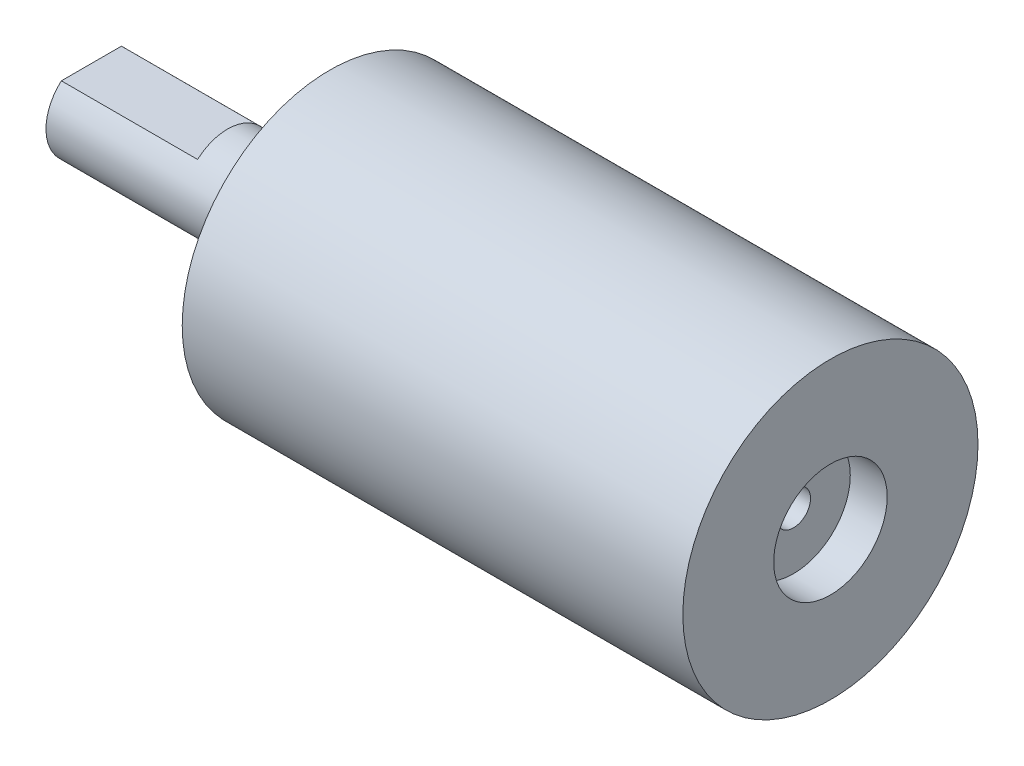
ISO-10303-21;
HEADER;
FILE_DESCRIPTION(('STEP AP214'),'2;1');
FILE_NAME('part.step','',(''),(''),'','','');
FILE_SCHEMA(('AUTOMOTIVE_DESIGN { 1 0 10303 214 1 1 1 1 }'));
ENDSEC;
DATA;
#1=APPLICATION_CONTEXT('core data for automotive mechanical design processes');
#2=APPLICATION_PROTOCOL_DEFINITION('international standard','automotive_design',2000,#1);
#3=PRODUCT_CONTEXT('',#1,'mechanical');
#4=PRODUCT('Part','Part','',(#3));
#5=PRODUCT_RELATED_PRODUCT_CATEGORY('part','',(#4));
#6=PRODUCT_DEFINITION_FORMATION('','',#4);
#7=PRODUCT_DEFINITION_CONTEXT('part definition',#1,'design');
#8=PRODUCT_DEFINITION('design','',#6,#7);
#9=PRODUCT_DEFINITION_SHAPE('','',#8);
#10=(LENGTH_UNIT() NAMED_UNIT(*) SI_UNIT(.MILLI.,.METRE.));
#11=(NAMED_UNIT(*) PLANE_ANGLE_UNIT() SI_UNIT($,.RADIAN.));
#12=(NAMED_UNIT(*) SI_UNIT($,.STERADIAN.) SOLID_ANGLE_UNIT());
#13=UNCERTAINTY_MEASURE_WITH_UNIT(LENGTH_MEASURE(1.E-05),#10,'distance_accuracy_value','');
#14=(GEOMETRIC_REPRESENTATION_CONTEXT(3) GLOBAL_UNCERTAINTY_ASSIGNED_CONTEXT((#13)) GLOBAL_UNIT_ASSIGNED_CONTEXT((#10,
#11,#12)) REPRESENTATION_CONTEXT('',''));
#15=CARTESIAN_POINT('',(0.,0.,0.));
#16=DIRECTION('',(0.,0.,1.));
#17=DIRECTION('',(1.,0.,0.));
#18=AXIS2_PLACEMENT_3D('',#15,#16,#17);
#19=CARTESIAN_POINT('',(0.,0.,0.));
#20=DIRECTION('',(-1.,0.,0.));
#21=DIRECTION('',(0.,0.,1.));
#22=AXIS2_PLACEMENT_3D('',#19,#20,#21);
#23=PLANE('',#22);
#24=DIRECTION('',(0.,0.,1.));
#25=VECTOR('',#24,1.);
#26=CARTESIAN_POINT('',(0.,3.,-2.64575131106459));
#27=LINE('',#26,#25);
#28=CARTESIAN_POINT('',(0.,3.,-2.64575131106459));
#29=VERTEX_POINT('',#28);
#30=CARTESIAN_POINT('',(0.,3.,2.64575131106459));
#31=VERTEX_POINT('',#30);
#32=EDGE_CURVE('E62',#29,#31,#27,.T.);
#33=ORIENTED_EDGE('',*,*,#32,.F.);
#34=CARTESIAN_POINT('',(0.,0.,0.));
#35=DIRECTION('',(1.,0.,0.));
#36=DIRECTION('',(0.,0.,-1.));
#37=AXIS2_PLACEMENT_3D('',#34,#35,#36);
#38=CIRCLE('',#37,4.);
#39=EDGE_CURVE('E11',#31,#29,#38,.T.);
#40=ORIENTED_EDGE('',*,*,#39,.F.);
#41=EDGE_LOOP('',(#33,#40));
#42=FACE_BOUND('',#41,.T.);
#43=ADVANCED_FACE('F34',(#42),#23,.T.);
#44=CARTESIAN_POINT('',(0.,0.,0.));
#45=DIRECTION('',(1.,0.,0.));
#46=DIRECTION('',(0.,0.,-1.));
#47=AXIS2_PLACEMENT_3D('',#44,#45,#46);
#48=CYLINDRICAL_SURFACE('',#47,4.);
#49=DIRECTION('',(-1.,0.,0.));
#50=VECTOR('',#49,1.);
#51=CARTESIAN_POINT('',(12.,3.,-2.64575131106459));
#52=LINE('',#51,#50);
#53=CARTESIAN_POINT('',(12.,3.,-2.64575131106459));
#54=VERTEX_POINT('',#53);
#55=EDGE_CURVE('E59',#54,#29,#52,.T.);
#56=ORIENTED_EDGE('',*,*,#55,.F.);
#57=CARTESIAN_POINT('',(12.,0.,0.));
#58=DIRECTION('',(-1.,0.,0.));
#59=DIRECTION('',(0.,0.,1.));
#60=AXIS2_PLACEMENT_3D('',#57,#58,#59);
#61=CIRCLE('',#60,4.);
#62=CARTESIAN_POINT('',(12.,3.,2.64575131106459));
#63=VERTEX_POINT('',#62);
#64=EDGE_CURVE('E52',#63,#54,#61,.T.);
#65=ORIENTED_EDGE('',*,*,#64,.F.);
#66=DIRECTION('',(-1.,0.,0.));
#67=VECTOR('',#66,1.);
#68=CARTESIAN_POINT('',(12.,3.,2.64575131106459));
#69=LINE('',#68,#67);
#70=EDGE_CURVE('E65',#63,#31,#69,.T.);
#71=ORIENTED_EDGE('',*,*,#70,.T.);
#72=ORIENTED_EDGE('',*,*,#39,.T.);
#73=EDGE_LOOP('',(#56,#65,#71,#72));
#74=FACE_BOUND('',#73,.T.);
#75=CARTESIAN_POINT('',(19.,0.,0.));
#76=DIRECTION('',(1.,0.,0.));
#77=DIRECTION('',(0.,0.,-1.));
#78=AXIS2_PLACEMENT_3D('',#75,#76,#77);
#79=CIRCLE('',#78,4.);
#80=CARTESIAN_POINT('',(19.,0.,-4.));
#81=VERTEX_POINT('',#80);
#82=EDGE_CURVE('E41',#81,#81,#79,.T.);
#83=ORIENTED_EDGE('',*,*,#82,.F.);
#84=EDGE_LOOP('',(#83));
#85=FACE_BOUND('',#84,.T.);
#86=ADVANCED_FACE('F70',(#74,#85),#48,.T.);
#87=CARTESIAN_POINT('',(19.,4.,0.));
#88=DIRECTION('',(-1.,0.,0.));
#89=DIRECTION('',(0.,0.,1.));
#90=AXIS2_PLACEMENT_3D('',#87,#88,#89);
#91=PLANE('',#90);
#92=ORIENTED_EDGE('',*,*,#82,.T.);
#93=EDGE_LOOP('',(#92));
#94=FACE_BOUND('',#93,.T.);
#95=CARTESIAN_POINT('',(19.,0.,0.));
#96=DIRECTION('',(1.,0.,0.));
#97=DIRECTION('',(0.,0.,-1.));
#98=AXIS2_PLACEMENT_3D('',#95,#96,#97);
#99=CIRCLE('',#98,9.5);
#100=CARTESIAN_POINT('',(19.,0.,-9.5));
#101=VERTEX_POINT('',#100);
#102=EDGE_CURVE('E132',#101,#101,#99,.T.);
#103=ORIENTED_EDGE('',*,*,#102,.F.);
#104=EDGE_LOOP('',(#103));
#105=FACE_BOUND('',#104,.T.);
#106=ADVANCED_FACE('F137',(#94,#105),#91,.T.);
#107=CARTESIAN_POINT('',(0.,0.,0.));
#108=DIRECTION('',(1.,0.,0.));
#109=DIRECTION('',(0.,0.,-1.));
#110=AXIS2_PLACEMENT_3D('',#107,#108,#109);
#111=CYLINDRICAL_SURFACE('',#110,9.5);
#112=ORIENTED_EDGE('',*,*,#102,.T.);
#113=EDGE_LOOP('',(#112));
#114=FACE_BOUND('',#113,.T.);
#115=CARTESIAN_POINT('',(21.,0.,0.));
#116=DIRECTION('',(1.,0.,0.));
#117=DIRECTION('',(0.,0.,-1.));
#118=AXIS2_PLACEMENT_3D('',#115,#116,#117);
#119=CIRCLE('',#118,9.5);
#120=CARTESIAN_POINT('',(21.,0.,-9.5));
#121=VERTEX_POINT('',#120);
#122=EDGE_CURVE('E129',#121,#121,#119,.T.);
#123=ORIENTED_EDGE('',*,*,#122,.F.);
#124=EDGE_LOOP('',(#123));
#125=FACE_BOUND('',#124,.T.);
#126=ADVANCED_FACE('F144',(#114,#125),#111,.T.);
#127=CARTESIAN_POINT('',(21.,9.5,0.));
#128=DIRECTION('',(-1.,0.,0.));
#129=DIRECTION('',(0.,0.,1.));
#130=AXIS2_PLACEMENT_3D('',#127,#128,#129);
#131=PLANE('',#130);
#132=CARTESIAN_POINT('',(21.,11.25,0.));
#133=DIRECTION('',(-1.,0.,0.));
#134=DIRECTION('',(0.,0.,1.));
#135=AXIS2_PLACEMENT_3D('',#132,#133,#134);
#136=CIRCLE('',#135,1.);
#137=CARTESIAN_POINT('',(21.,11.25,1.));
#138=VERTEX_POINT('',#137);
#139=EDGE_CURVE('E83',#138,#138,#136,.T.);
#140=ORIENTED_EDGE('',*,*,#139,.F.);
#141=EDGE_LOOP('',(#140));
#142=FACE_BOUND('',#141,.T.);
#143=CARTESIAN_POINT('',(21.,5.62499999999944,-9.74278579257462));
#144=DIRECTION('',(-1.,0.,0.));
#145=DIRECTION('',(0.,0.,1.));
#146=AXIS2_PLACEMENT_3D('',#143,#144,#145);
#147=CIRCLE('',#146,1.0000000000006);
#148=CARTESIAN_POINT('',(21.,5.62499999999944,-8.74278579257402));
#149=VERTEX_POINT('',#148);
#150=EDGE_CURVE('E72',#149,#149,#147,.T.);
#151=ORIENTED_EDGE('',*,*,#150,.F.);
#152=EDGE_LOOP('',(#151));
#153=FACE_BOUND('',#152,.T.);
#154=CARTESIAN_POINT('',(21.,-5.62500000000056,-9.74278579257398));
#155=DIRECTION('',(-1.,0.,0.));
#156=DIRECTION('',(0.,0.,1.));
#157=AXIS2_PLACEMENT_3D('',#154,#155,#156);
#158=CIRCLE('',#157,1.00000000000118);
#159=CARTESIAN_POINT('',(21.,-5.62500000000056,-8.74278579257279));
#160=VERTEX_POINT('',#159);
#161=EDGE_CURVE('E88',#160,#160,#158,.T.);
#162=ORIENTED_EDGE('',*,*,#161,.F.);
#163=EDGE_LOOP('',(#162));
#164=FACE_BOUND('',#163,.T.);
#165=CARTESIAN_POINT('',(21.,-11.25,1.2762214690701E-12));
#166=DIRECTION('',(-1.,0.,0.));
#167=DIRECTION('',(0.,0.,1.));
#168=AXIS2_PLACEMENT_3D('',#165,#166,#167);
#169=CIRCLE('',#168,1.0000000000013);
#170=CARTESIAN_POINT('',(21.,-11.25,1.00000000000257));
#171=VERTEX_POINT('',#170);
#172=EDGE_CURVE('E104',#171,#171,#169,.T.);
#173=ORIENTED_EDGE('',*,*,#172,.F.);
#174=EDGE_LOOP('',(#173));
#175=FACE_BOUND('',#174,.T.);
#176=CARTESIAN_POINT('',(21.,-5.62499999999945,9.74278579257589));
#177=DIRECTION('',(-1.,0.,0.));
#178=DIRECTION('',(0.,0.,1.));
#179=AXIS2_PLACEMENT_3D('',#176,#177,#178);
#180=CIRCLE('',#179,1.00000000000081);
#181=CARTESIAN_POINT('',(21.,-5.62499999999945,10.7427857925767));
#182=VERTEX_POINT('',#181);
#183=EDGE_CURVE('E98',#182,#182,#180,.T.);
#184=ORIENTED_EDGE('',*,*,#183,.F.);
#185=EDGE_LOOP('',(#184));
#186=FACE_BOUND('',#185,.T.);
#187=CARTESIAN_POINT('',(21.,5.62500000000056,9.74278579257525));
#188=DIRECTION('',(-1.,0.,0.));
#189=DIRECTION('',(0.,0.,1.));
#190=AXIS2_PLACEMENT_3D('',#187,#188,#189);
#191=CIRCLE('',#190,1.00000000000017);
#192=CARTESIAN_POINT('',(21.,5.62500000000056,10.7427857925754));
#193=VERTEX_POINT('',#192);
#194=EDGE_CURVE('E92',#193,#193,#191,.T.);
#195=ORIENTED_EDGE('',*,*,#194,.F.);
#196=EDGE_LOOP('',(#195));
#197=FACE_BOUND('',#196,.T.);
#198=ORIENTED_EDGE('',*,*,#122,.T.);
#199=EDGE_LOOP('',(#198));
#200=FACE_BOUND('',#199,.T.);
#201=CARTESIAN_POINT('',(21.,0.,0.));
#202=DIRECTION('',(1.,0.,0.));
#203=DIRECTION('',(0.,0.,-1.));
#204=AXIS2_PLACEMENT_3D('',#201,#202,#203);
#205=CIRCLE('',#204,13.);
#206=CARTESIAN_POINT('',(21.,0.,-13.));
#207=VERTEX_POINT('',#206);
#208=EDGE_CURVE('E126',#207,#207,#205,.T.);
#209=ORIENTED_EDGE('',*,*,#208,.F.);
#210=EDGE_LOOP('',(#209));
#211=FACE_BOUND('',#210,.T.);
#212=ADVANCED_FACE('F149',(#142,#153,#164,#175,#186,#197,#200,#211),#131,.T.);
#213=CARTESIAN_POINT('',(0.,0.,0.));
#214=DIRECTION('',(1.,0.,0.));
#215=DIRECTION('',(0.,0.,-1.));
#216=AXIS2_PLACEMENT_3D('',#213,#214,#215);
#217=CYLINDRICAL_SURFACE('',#216,13.);
#218=ORIENTED_EDGE('',*,*,#208,.T.);
#219=EDGE_LOOP('',(#218));
#220=FACE_BOUND('',#219,.T.);
#221=CARTESIAN_POINT('',(65.1,0.,0.));
#222=DIRECTION('',(1.,0.,0.));
#223=DIRECTION('',(0.,0.,-1.));
#224=AXIS2_PLACEMENT_3D('',#221,#222,#223);
#225=CIRCLE('',#224,13.);
#226=CARTESIAN_POINT('',(65.1,0.,-13.));
#227=VERTEX_POINT('',#226);
#228=EDGE_CURVE('E123',#227,#227,#225,.T.);
#229=ORIENTED_EDGE('',*,*,#228,.F.);
#230=EDGE_LOOP('',(#229));
#231=FACE_BOUND('',#230,.T.);
#232=ADVANCED_FACE('F153',(#220,#231),#217,.T.);
#233=CARTESIAN_POINT('',(65.1,13.,0.));
#234=DIRECTION('',(1.,0.,0.));
#235=DIRECTION('',(0.,0.,-1.));
#236=AXIS2_PLACEMENT_3D('',#233,#234,#235);
#237=PLANE('',#236);
#238=ORIENTED_EDGE('',*,*,#228,.T.);
#239=EDGE_LOOP('',(#238));
#240=FACE_BOUND('',#239,.T.);
#241=CARTESIAN_POINT('',(65.1,0.,0.));
#242=DIRECTION('',(1.,0.,0.));
#243=DIRECTION('',(0.,0.,-1.));
#244=AXIS2_PLACEMENT_3D('',#241,#242,#243);
#245=CIRCLE('',#244,5.00000000000001);
#246=CARTESIAN_POINT('',(65.1,0.,-5.00000000000001));
#247=VERTEX_POINT('',#246);
#248=EDGE_CURVE('E120',#247,#247,#245,.T.);
#249=ORIENTED_EDGE('',*,*,#248,.F.);
#250=EDGE_LOOP('',(#249));
#251=FACE_BOUND('',#250,.T.);
#252=ADVANCED_FACE('F157',(#240,#251),#237,.T.);
#253=CARTESIAN_POINT('',(0.,0.,0.));
#254=DIRECTION('',(1.,0.,0.));
#255=DIRECTION('',(0.,0.,-1.));
#256=AXIS2_PLACEMENT_3D('',#253,#254,#255);
#257=CYLINDRICAL_SURFACE('',#256,5.00000000000001);
#258=ORIENTED_EDGE('',*,*,#248,.T.);
#259=EDGE_LOOP('',(#258));
#260=FACE_BOUND('',#259,.T.);
#261=CARTESIAN_POINT('',(61.85,0.,0.));
#262=DIRECTION('',(1.,0.,0.));
#263=DIRECTION('',(0.,0.,-1.));
#264=AXIS2_PLACEMENT_3D('',#261,#262,#263);
#265=CIRCLE('',#264,5.00000000000001);
#266=CARTESIAN_POINT('',(61.85,0.,-5.00000000000001));
#267=VERTEX_POINT('',#266);
#268=EDGE_CURVE('E117',#267,#267,#265,.T.);
#269=ORIENTED_EDGE('',*,*,#268,.F.);
#270=EDGE_LOOP('',(#269));
#271=FACE_BOUND('',#270,.T.);
#272=ADVANCED_FACE('F161',(#260,#271),#257,.F.);
#273=CARTESIAN_POINT('',(61.85,5.00000000000001,0.));
#274=DIRECTION('',(1.,0.,0.));
#275=DIRECTION('',(0.,0.,-1.));
#276=AXIS2_PLACEMENT_3D('',#273,#274,#275);
#277=PLANE('',#276);
#278=ORIENTED_EDGE('',*,*,#268,.T.);
#279=EDGE_LOOP('',(#278));
#280=FACE_BOUND('',#279,.T.);
#281=CARTESIAN_POINT('',(61.85,0.,0.));
#282=DIRECTION('',(1.,0.,0.));
#283=DIRECTION('',(0.,0.,-1.));
#284=AXIS2_PLACEMENT_3D('',#281,#282,#283);
#285=CIRCLE('',#284,1.50000000000001);
#286=CARTESIAN_POINT('',(61.85,0.,-1.50000000000001));
#287=VERTEX_POINT('',#286);
#288=EDGE_CURVE('E114',#287,#287,#285,.T.);
#289=ORIENTED_EDGE('',*,*,#288,.F.);
#290=EDGE_LOOP('',(#289));
#291=FACE_BOUND('',#290,.T.);
#292=ADVANCED_FACE('F165',(#280,#291),#277,.T.);
#293=CARTESIAN_POINT('',(0.,0.,0.));
#294=DIRECTION('',(1.,0.,0.));
#295=DIRECTION('',(0.,0.,-1.));
#296=AXIS2_PLACEMENT_3D('',#293,#294,#295);
#297=CYLINDRICAL_SURFACE('',#296,1.50000000000001);
#298=ORIENTED_EDGE('',*,*,#288,.T.);
#299=EDGE_LOOP('',(#298));
#300=FACE_BOUND('',#299,.T.);
#301=CARTESIAN_POINT('',(54.1,0.,0.));
#302=DIRECTION('',(1.,0.,0.));
#303=DIRECTION('',(0.,0.,-1.));
#304=AXIS2_PLACEMENT_3D('',#301,#302,#303);
#305=CIRCLE('',#304,1.50000000000001);
#306=CARTESIAN_POINT('',(54.1,0.,-1.50000000000001));
#307=VERTEX_POINT('',#306);
#308=EDGE_CURVE('E82',#307,#307,#305,.T.);
#309=ORIENTED_EDGE('',*,*,#308,.F.);
#310=EDGE_LOOP('',(#309));
#311=FACE_BOUND('',#310,.T.);
#312=ADVANCED_FACE('F169',(#300,#311),#297,.F.);
#313=CARTESIAN_POINT('',(54.1,1.50000000000001,0.));
#314=DIRECTION('',(1.,0.,0.));
#315=DIRECTION('',(0.,0.,-1.));
#316=AXIS2_PLACEMENT_3D('',#313,#314,#315);
#317=PLANE('',#316);
#318=ORIENTED_EDGE('',*,*,#308,.T.);
#319=EDGE_LOOP('',(#318));
#320=FACE_BOUND('',#319,.T.);
#321=ADVANCED_FACE('F173',(#320),#317,.T.);
#322=CARTESIAN_POINT('',(24.6,5.62500000000056,9.74278579257525));
#323=DIRECTION('',(-1.,0.,0.));
#324=DIRECTION('',(0.,0.,1.));
#325=AXIS2_PLACEMENT_3D('',#322,#323,#324);
#326=CYLINDRICAL_SURFACE('',#325,1.00000000000017);
#327=CARTESIAN_POINT('',(24.6,5.62500000000056,9.74278579257525));
#328=DIRECTION('',(-1.,0.,0.));
#329=DIRECTION('',(0.,0.,1.));
#330=AXIS2_PLACEMENT_3D('',#327,#328,#329);
#331=CIRCLE('',#330,1.00000000000017);
#332=CARTESIAN_POINT('',(24.6,5.62500000000056,10.7427857925754));
#333=VERTEX_POINT('',#332);
#334=EDGE_CURVE('E86',#333,#333,#331,.T.);
#335=ORIENTED_EDGE('',*,*,#334,.F.);
#336=EDGE_LOOP('',(#335));
#337=FACE_BOUND('',#336,.T.);
#338=ORIENTED_EDGE('',*,*,#194,.T.);
#339=EDGE_LOOP('',(#338));
#340=FACE_BOUND('',#339,.T.);
#341=ADVANCED_FACE('F177',(#337,#340),#326,.F.);
#342=CARTESIAN_POINT('',(24.6,5.62500000000056,9.74278579257525));
#343=DIRECTION('',(-1.,0.,0.));
#344=DIRECTION('',(0.,0.,1.));
#345=AXIS2_PLACEMENT_3D('',#342,#343,#344);
#346=PLANE('',#345);
#347=ORIENTED_EDGE('',*,*,#334,.T.);
#348=EDGE_LOOP('',(#347));
#349=FACE_BOUND('',#348,.T.);
#350=ADVANCED_FACE('F200',(#349),#346,.T.);
#351=CARTESIAN_POINT('',(24.6,-5.62499999999945,9.74278579257589));
#352=DIRECTION('',(-1.,0.,0.));
#353=DIRECTION('',(0.,0.,1.));
#354=AXIS2_PLACEMENT_3D('',#351,#352,#353);
#355=CYLINDRICAL_SURFACE('',#354,1.00000000000081);
#356=CARTESIAN_POINT('',(24.6,-5.62499999999945,9.74278579257589));
#357=DIRECTION('',(-1.,0.,0.));
#358=DIRECTION('',(0.,0.,1.));
#359=AXIS2_PLACEMENT_3D('',#356,#357,#358);
#360=CIRCLE('',#359,1.00000000000081);
#361=CARTESIAN_POINT('',(24.6,-5.62499999999945,10.7427857925767));
#362=VERTEX_POINT('',#361);
#363=EDGE_CURVE('E95',#362,#362,#360,.T.);
#364=ORIENTED_EDGE('',*,*,#363,.F.);
#365=EDGE_LOOP('',(#364));
#366=FACE_BOUND('',#365,.T.);
#367=ORIENTED_EDGE('',*,*,#183,.T.);
#368=EDGE_LOOP('',(#367));
#369=FACE_BOUND('',#368,.T.);
#370=ADVANCED_FACE('F197',(#366,#369),#355,.F.);
#371=CARTESIAN_POINT('',(24.6,-5.62499999999945,9.74278579257589));
#372=DIRECTION('',(-1.,0.,0.));
#373=DIRECTION('',(0.,0.,1.));
#374=AXIS2_PLACEMENT_3D('',#371,#372,#373);
#375=PLANE('',#374);
#376=ORIENTED_EDGE('',*,*,#363,.T.);
#377=EDGE_LOOP('',(#376));
#378=FACE_BOUND('',#377,.T.);
#379=ADVANCED_FACE('F192',(#378),#375,.T.);
#380=CARTESIAN_POINT('',(24.6,-11.25,1.2762214690701E-12));
#381=DIRECTION('',(-1.,0.,0.));
#382=DIRECTION('',(0.,0.,1.));
#383=AXIS2_PLACEMENT_3D('',#380,#381,#382);
#384=CYLINDRICAL_SURFACE('',#383,1.0000000000013);
#385=CARTESIAN_POINT('',(24.6,-11.25,1.2762214690701E-12));
#386=DIRECTION('',(-1.,0.,0.));
#387=DIRECTION('',(0.,0.,1.));
#388=AXIS2_PLACEMENT_3D('',#385,#386,#387);
#389=CIRCLE('',#388,1.0000000000013);
#390=CARTESIAN_POINT('',(24.6,-11.25,1.00000000000257));
#391=VERTEX_POINT('',#390);
#392=EDGE_CURVE('E101',#391,#391,#389,.T.);
#393=ORIENTED_EDGE('',*,*,#392,.F.);
#394=EDGE_LOOP('',(#393));
#395=FACE_BOUND('',#394,.T.);
#396=ORIENTED_EDGE('',*,*,#172,.T.);
#397=EDGE_LOOP('',(#396));
#398=FACE_BOUND('',#397,.T.);
#399=ADVANCED_FACE('F189',(#395,#398),#384,.F.);
#400=CARTESIAN_POINT('',(24.6,-11.25,1.2762214690701E-12));
#401=DIRECTION('',(-1.,0.,0.));
#402=DIRECTION('',(0.,0.,1.));
#403=AXIS2_PLACEMENT_3D('',#400,#401,#402);
#404=PLANE('',#403);
#405=ORIENTED_EDGE('',*,*,#392,.T.);
#406=EDGE_LOOP('',(#405));
#407=FACE_BOUND('',#406,.T.);
#408=ADVANCED_FACE('F183',(#407),#404,.T.);
#409=CARTESIAN_POINT('',(24.6,-5.62500000000056,-9.74278579257398));
#410=DIRECTION('',(-1.,0.,0.));
#411=DIRECTION('',(0.,0.,1.));
#412=AXIS2_PLACEMENT_3D('',#409,#410,#411);
#413=CYLINDRICAL_SURFACE('',#412,1.00000000000118);
#414=CARTESIAN_POINT('',(24.6,-5.62500000000056,-9.74278579257398));
#415=DIRECTION('',(-1.,0.,0.));
#416=DIRECTION('',(0.,0.,1.));
#417=AXIS2_PLACEMENT_3D('',#414,#415,#416);
#418=CIRCLE('',#417,1.00000000000118);
#419=CARTESIAN_POINT('',(24.6,-5.62500000000056,-8.74278579257279));
#420=VERTEX_POINT('',#419);
#421=EDGE_CURVE('E107',#420,#420,#418,.T.);
#422=ORIENTED_EDGE('',*,*,#421,.F.);
#423=EDGE_LOOP('',(#422));
#424=FACE_BOUND('',#423,.T.);
#425=ORIENTED_EDGE('',*,*,#161,.T.);
#426=EDGE_LOOP('',(#425));
#427=FACE_BOUND('',#426,.T.);
#428=ADVANCED_FACE('F179',(#424,#427),#413,.F.);
#429=CARTESIAN_POINT('',(24.6,-5.62500000000056,-9.74278579257398));
#430=DIRECTION('',(-1.,0.,0.));
#431=DIRECTION('',(0.,0.,1.));
#432=AXIS2_PLACEMENT_3D('',#429,#430,#431);
#433=PLANE('',#432);
#434=ORIENTED_EDGE('',*,*,#421,.T.);
#435=EDGE_LOOP('',(#434));
#436=FACE_BOUND('',#435,.T.);
#437=ADVANCED_FACE('F182',(#436),#433,.T.);
#438=CARTESIAN_POINT('',(24.6,5.62499999999944,-9.74278579257462));
#439=DIRECTION('',(-1.,0.,0.));
#440=DIRECTION('',(0.,0.,1.));
#441=AXIS2_PLACEMENT_3D('',#438,#439,#440);
#442=CYLINDRICAL_SURFACE('',#441,1.0000000000006);
#443=CARTESIAN_POINT('',(24.6,5.62499999999944,-9.74278579257462));
#444=DIRECTION('',(-1.,0.,0.));
#445=DIRECTION('',(0.,0.,1.));
#446=AXIS2_PLACEMENT_3D('',#443,#444,#445);
#447=CIRCLE('',#446,1.0000000000006);
#448=CARTESIAN_POINT('',(24.6,5.62499999999944,-8.74278579257402));
#449=VERTEX_POINT('',#448);
#450=EDGE_CURVE('E75',#449,#449,#447,.T.);
#451=ORIENTED_EDGE('',*,*,#450,.F.);
#452=EDGE_LOOP('',(#451));
#453=FACE_BOUND('',#452,.T.);
#454=ORIENTED_EDGE('',*,*,#150,.T.);
#455=EDGE_LOOP('',(#454));
#456=FACE_BOUND('',#455,.T.);
#457=ADVANCED_FACE('F187',(#453,#456),#442,.F.);
#458=CARTESIAN_POINT('',(24.6,5.62499999999944,-9.74278579257462));
#459=DIRECTION('',(-1.,0.,0.));
#460=DIRECTION('',(0.,0.,1.));
#461=AXIS2_PLACEMENT_3D('',#458,#459,#460);
#462=PLANE('',#461);
#463=ORIENTED_EDGE('',*,*,#450,.T.);
#464=EDGE_LOOP('',(#463));
#465=FACE_BOUND('',#464,.T.);
#466=ADVANCED_FACE('F213',(#465),#462,.T.);
#467=CARTESIAN_POINT('',(24.6,11.25,0.));
#468=DIRECTION('',(-1.,0.,0.));
#469=DIRECTION('',(0.,0.,1.));
#470=AXIS2_PLACEMENT_3D('',#467,#468,#469);
#471=CYLINDRICAL_SURFACE('',#470,1.);
#472=CARTESIAN_POINT('',(24.6,11.25,0.));
#473=DIRECTION('',(-1.,0.,0.));
#474=DIRECTION('',(0.,0.,1.));
#475=AXIS2_PLACEMENT_3D('',#472,#473,#474);
#476=CIRCLE('',#475,1.);
#477=CARTESIAN_POINT('',(24.6,11.25,1.));
#478=VERTEX_POINT('',#477);
#479=EDGE_CURVE('E79',#478,#478,#476,.T.);
#480=ORIENTED_EDGE('',*,*,#479,.F.);
#481=EDGE_LOOP('',(#480));
#482=FACE_BOUND('',#481,.T.);
#483=ORIENTED_EDGE('',*,*,#139,.T.);
#484=EDGE_LOOP('',(#483));
#485=FACE_BOUND('',#484,.T.);
#486=ADVANCED_FACE('F217',(#482,#485),#471,.F.);
#487=CARTESIAN_POINT('',(24.6,11.25,0.));
#488=DIRECTION('',(-1.,0.,0.));
#489=DIRECTION('',(0.,0.,1.));
#490=AXIS2_PLACEMENT_3D('',#487,#488,#489);
#491=PLANE('',#490);
#492=ORIENTED_EDGE('',*,*,#479,.T.);
#493=EDGE_LOOP('',(#492));
#494=FACE_BOUND('',#493,.T.);
#495=ADVANCED_FACE('F221',(#494),#491,.T.);
#496=CARTESIAN_POINT('',(12.,3.,-2.64575131106459));
#497=DIRECTION('',(0.,-1.,0.));
#498=DIRECTION('',(0.,0.,-1.));
#499=AXIS2_PLACEMENT_3D('',#496,#497,#498);
#500=PLANE('',#499);
#501=ORIENTED_EDGE('',*,*,#32,.T.);
#502=ORIENTED_EDGE('',*,*,#70,.F.);
#503=DIRECTION('',(0.,0.,1.));
#504=VECTOR('',#503,1.);
#505=CARTESIAN_POINT('',(12.,3.,-2.64575131106459));
#506=LINE('',#505,#504);
#507=EDGE_CURVE('E47',#54,#63,#506,.T.);
#508=ORIENTED_EDGE('',*,*,#507,.F.);
#509=ORIENTED_EDGE('',*,*,#55,.T.);
#510=EDGE_LOOP('',(#501,#502,#508,#509));
#511=FACE_BOUND('',#510,.T.);
#512=ADVANCED_FACE('F61',(#511),#500,.F.);
#513=CARTESIAN_POINT('',(12.,0.,0.));
#514=DIRECTION('',(-1.,0.,0.));
#515=DIRECTION('',(0.,0.,1.));
#516=AXIS2_PLACEMENT_3D('',#513,#514,#515);
#517=PLANE('',#516);
#518=ORIENTED_EDGE('',*,*,#64,.T.);
#519=ORIENTED_EDGE('',*,*,#507,.T.);
#520=EDGE_LOOP('',(#518,#519));
#521=FACE_BOUND('',#520,.T.);
#522=ADVANCED_FACE('F228',(#521),#517,.T.);
#523=CLOSED_SHELL('',(#43,#86,#106,#126,#212,#232,#252,#272,#292,#312,#321,#341,#350,#370,#379,
#399,#408,#428,#437,#457,#466,#486,#495,#512,#522));
#524=MANIFOLD_SOLID_BREP('B2',#523);
#525=ADVANCED_BREP_SHAPE_REPRESENTATION('',(#18,#524),#14);
#526=SHAPE_DEFINITION_REPRESENTATION(#9,#525);
ENDSEC;
END-ISO-10303-21;
